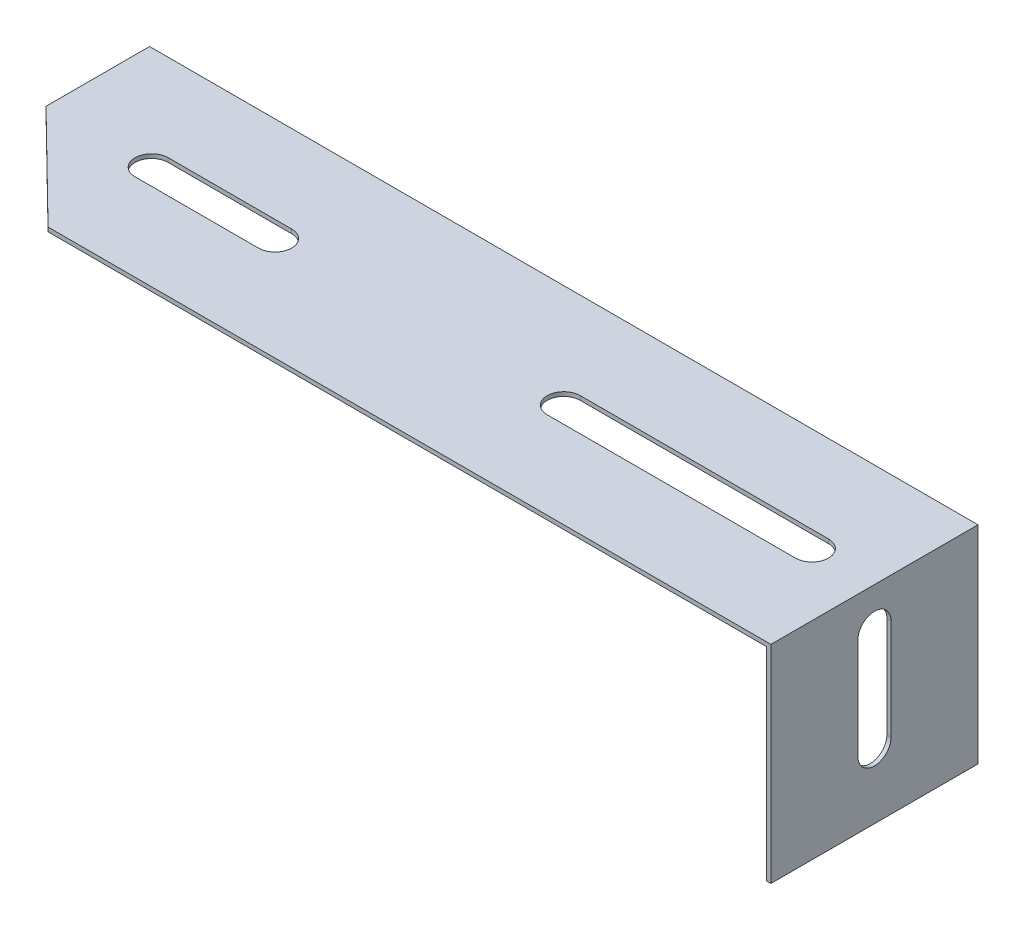
ISO-10303-21;
HEADER;
FILE_DESCRIPTION(('STEP AP214'),'2;1');
FILE_NAME('part.step','',(''),(''),'','','');
FILE_SCHEMA(('AUTOMOTIVE_DESIGN { 1 0 10303 214 1 1 1 1 }'));
ENDSEC;
DATA;
#1=APPLICATION_CONTEXT('core data for automotive mechanical design processes');
#2=APPLICATION_PROTOCOL_DEFINITION('international standard','automotive_design',2000,#1);
#3=PRODUCT_CONTEXT('',#1,'mechanical');
#4=PRODUCT('Part','Part','',(#3));
#5=PRODUCT_RELATED_PRODUCT_CATEGORY('part','',(#4));
#6=PRODUCT_DEFINITION_FORMATION('','',#4);
#7=PRODUCT_DEFINITION_CONTEXT('part definition',#1,'design');
#8=PRODUCT_DEFINITION('design','',#6,#7);
#9=PRODUCT_DEFINITION_SHAPE('','',#8);
#10=(LENGTH_UNIT() NAMED_UNIT(*) SI_UNIT(.MILLI.,.METRE.));
#11=(NAMED_UNIT(*) PLANE_ANGLE_UNIT() SI_UNIT($,.RADIAN.));
#12=(NAMED_UNIT(*) SI_UNIT($,.STERADIAN.) SOLID_ANGLE_UNIT());
#13=UNCERTAINTY_MEASURE_WITH_UNIT(LENGTH_MEASURE(1.E-05),#10,'distance_accuracy_value','');
#14=(GEOMETRIC_REPRESENTATION_CONTEXT(3) GLOBAL_UNCERTAINTY_ASSIGNED_CONTEXT((#13)) GLOBAL_UNIT_ASSIGNED_CONTEXT((#10,
#11,#12)) REPRESENTATION_CONTEXT('',''));
#15=CARTESIAN_POINT('',(0.,0.,0.));
#16=DIRECTION('',(0.,0.,1.));
#17=DIRECTION('',(1.,0.,0.));
#18=AXIS2_PLACEMENT_3D('',#15,#16,#17);
#19=CARTESIAN_POINT('',(0.,0.,0.));
#20=DIRECTION('',(0.,1.,0.));
#21=DIRECTION('',(0.,0.,1.));
#22=AXIS2_PLACEMENT_3D('',#19,#20,#21);
#23=PLANE('',#22);
#24=CARTESIAN_POINT('',(-144.7,0.,-25.));
#25=DIRECTION('',(0.,1.,0.));
#26=DIRECTION('',(0.,0.,1.));
#27=AXIS2_PLACEMENT_3D('',#24,#25,#26);
#28=CIRCLE('',#27,4.);
#29=CARTESIAN_POINT('',(-144.7,0.,-21.));
#30=VERTEX_POINT('',#29);
#31=CARTESIAN_POINT('',(-144.7,0.,-29.));
#32=VERTEX_POINT('',#31);
#33=EDGE_CURVE('E271',#30,#32,#28,.T.);
#34=ORIENTED_EDGE('',*,*,#33,.T.);
#35=DIRECTION('',(1.,0.,0.));
#36=VECTOR('',#35,1.);
#37=CARTESIAN_POINT('',(0.,0.,-29.));
#38=LINE('',#37,#36);
#39=CARTESIAN_POINT('',(-174.5,0.,-29.));
#40=VERTEX_POINT('',#39);
#41=EDGE_CURVE('E280',#40,#32,#38,.T.);
#42=ORIENTED_EDGE('',*,*,#41,.F.);
#43=CARTESIAN_POINT('',(-174.5,0.,-25.));
#44=DIRECTION('',(0.,1.,0.));
#45=DIRECTION('',(0.,0.,1.));
#46=AXIS2_PLACEMENT_3D('',#43,#44,#45);
#47=CIRCLE('',#46,4.);
#48=CARTESIAN_POINT('',(-174.5,0.,-21.));
#49=VERTEX_POINT('',#48);
#50=EDGE_CURVE('E277',#40,#49,#47,.T.);
#51=ORIENTED_EDGE('',*,*,#50,.T.);
#52=DIRECTION('',(1.,0.,0.));
#53=VECTOR('',#52,1.);
#54=CARTESIAN_POINT('',(0.,0.,-21.));
#55=LINE('',#54,#53);
#56=EDGE_CURVE('E274',#49,#30,#55,.T.);
#57=ORIENTED_EDGE('',*,*,#56,.T.);
#58=EDGE_LOOP('',(#34,#42,#51,#57));
#59=FACE_BOUND('',#58,.T.);
#60=CARTESIAN_POINT('',(-15.08,0.,-25.));
#61=DIRECTION('',(0.,1.,0.));
#62=DIRECTION('',(0.,0.,1.));
#63=AXIS2_PLACEMENT_3D('',#60,#61,#62);
#64=CIRCLE('',#63,4.);
#65=CARTESIAN_POINT('',(-15.08,0.,-21.));
#66=VERTEX_POINT('',#65);
#67=CARTESIAN_POINT('',(-15.08,0.,-29.));
#68=VERTEX_POINT('',#67);
#69=EDGE_CURVE('E220',#66,#68,#64,.T.);
#70=ORIENTED_EDGE('',*,*,#69,.T.);
#71=DIRECTION('',(1.,0.,0.));
#72=VECTOR('',#71,1.);
#73=CARTESIAN_POINT('',(0.,0.,-29.));
#74=LINE('',#73,#72);
#75=CARTESIAN_POINT('',(-75.,0.,-29.));
#76=VERTEX_POINT('',#75);
#77=EDGE_CURVE('E268',#76,#68,#74,.T.);
#78=ORIENTED_EDGE('',*,*,#77,.F.);
#79=CARTESIAN_POINT('',(-75.,0.,-25.));
#80=DIRECTION('',(0.,1.,0.));
#81=DIRECTION('',(0.,0.,1.));
#82=AXIS2_PLACEMENT_3D('',#79,#80,#81);
#83=CIRCLE('',#82,4.);
#84=CARTESIAN_POINT('',(-75.,0.,-21.));
#85=VERTEX_POINT('',#84);
#86=EDGE_CURVE('E265',#76,#85,#83,.T.);
#87=ORIENTED_EDGE('',*,*,#86,.T.);
#88=DIRECTION('',(1.,0.,0.));
#89=VECTOR('',#88,1.);
#90=CARTESIAN_POINT('',(0.,0.,-21.));
#91=LINE('',#90,#89);
#92=EDGE_CURVE('E262',#85,#66,#91,.T.);
#93=ORIENTED_EDGE('',*,*,#92,.T.);
#94=EDGE_LOOP('',(#70,#78,#87,#93));
#95=FACE_BOUND('',#94,.T.);
#96=DIRECTION('',(0.,0.,-1.));
#97=VECTOR('',#96,1.);
#98=CARTESIAN_POINT('',(-1.,0.,0.));
#99=LINE('',#98,#97);
#100=CARTESIAN_POINT('',(-1.,0.,0.));
#101=VERTEX_POINT('',#100);
#102=CARTESIAN_POINT('',(-1.,0.,-50.));
#103=VERTEX_POINT('',#102);
#104=EDGE_CURVE('E11',#101,#103,#99,.T.);
#105=ORIENTED_EDGE('',*,*,#104,.F.);
#106=DIRECTION('',(-1.,0.,0.));
#107=VECTOR('',#106,1.);
#108=CARTESIAN_POINT('',(0.,0.,0.));
#109=LINE('',#108,#107);
#110=CARTESIAN_POINT('',(-174.5,0.,0.));
#111=VERTEX_POINT('',#110);
#112=EDGE_CURVE('E289',#101,#111,#109,.T.);
#113=ORIENTED_EDGE('',*,*,#112,.T.);
#114=DIRECTION('',(-0.714072839144579,0.,-0.700071410926057));
#115=VECTOR('',#114,1.);
#116=CARTESIAN_POINT('',(-85.5224465791021,0.,87.2328955106842));
#117=LINE('',#116,#115);
#118=CARTESIAN_POINT('',(-200.,0.,-25.));
#119=VERTEX_POINT('',#118);
#120=EDGE_CURVE('E286',#111,#119,#117,.T.);
#121=ORIENTED_EDGE('',*,*,#120,.T.);
#122=DIRECTION('',(0.,0.,-1.));
#123=VECTOR('',#122,1.);
#124=CARTESIAN_POINT('',(-200.,0.,0.));
#125=LINE('',#124,#123);
#126=CARTESIAN_POINT('',(-200.,0.,-50.));
#127=VERTEX_POINT('',#126);
#128=EDGE_CURVE('E283',#119,#127,#125,.T.);
#129=ORIENTED_EDGE('',*,*,#128,.T.);
#130=DIRECTION('',(-1.,0.,0.));
#131=VECTOR('',#130,1.);
#132=CARTESIAN_POINT('',(0.,0.,-50.));
#133=LINE('',#132,#131);
#134=EDGE_CURVE('E227',#103,#127,#133,.T.);
#135=ORIENTED_EDGE('',*,*,#134,.F.);
#136=EDGE_LOOP('',(#105,#113,#121,#129,#135));
#137=FACE_BOUND('',#136,.T.);
#138=ADVANCED_FACE('F39',(#59,#95,#137),#23,.F.);
#139=CARTESIAN_POINT('',(-200.,1.,0.));
#140=DIRECTION('',(-1.,0.,0.));
#141=DIRECTION('',(0.,0.,1.));
#142=AXIS2_PLACEMENT_3D('',#139,#140,#141);
#143=PLANE('',#142);
#144=ORIENTED_EDGE('',*,*,#128,.F.);
#145=DIRECTION('',(0.,-1.,0.));
#146=VECTOR('',#145,1.);
#147=CARTESIAN_POINT('',(-200.,1.,-25.));
#148=LINE('',#147,#146);
#149=CARTESIAN_POINT('',(-200.,1.,-25.));
#150=VERTEX_POINT('',#149);
#151=EDGE_CURVE('E47',#150,#119,#148,.T.);
#152=ORIENTED_EDGE('',*,*,#151,.F.);
#153=DIRECTION('',(0.,0.,-1.));
#154=VECTOR('',#153,1.);
#155=CARTESIAN_POINT('',(-200.,1.,0.));
#156=LINE('',#155,#154);
#157=CARTESIAN_POINT('',(-200.,1.,-50.));
#158=VERTEX_POINT('',#157);
#159=EDGE_CURVE('E246',#150,#158,#156,.T.);
#160=ORIENTED_EDGE('',*,*,#159,.T.);
#161=DIRECTION('',(0.,-1.,0.));
#162=VECTOR('',#161,1.);
#163=CARTESIAN_POINT('',(-200.,1.,-50.));
#164=LINE('',#163,#162);
#165=EDGE_CURVE('E292',#158,#127,#164,.T.);
#166=ORIENTED_EDGE('',*,*,#165,.T.);
#167=EDGE_LOOP('',(#144,#152,#160,#166));
#168=FACE_BOUND('',#167,.T.);
#169=ADVANCED_FACE('F352',(#168),#143,.T.);
#170=CARTESIAN_POINT('',(-85.5224465791021,1.,87.2328955106842));
#171=DIRECTION('',(-0.700071410926057,0.,0.714072839144579));
#172=DIRECTION('',(0.714072839144579,0.,0.700071410926057));
#173=AXIS2_PLACEMENT_3D('',#170,#171,#172);
#174=PLANE('',#173);
#175=ORIENTED_EDGE('',*,*,#120,.F.);
#176=DIRECTION('',(0.,-1.,0.));
#177=VECTOR('',#176,1.);
#178=CARTESIAN_POINT('',(-174.5,1.,0.));
#179=LINE('',#178,#177);
#180=CARTESIAN_POINT('',(-174.5,1.,0.));
#181=VERTEX_POINT('',#180);
#182=EDGE_CURVE('E300',#181,#111,#179,.T.);
#183=ORIENTED_EDGE('',*,*,#182,.F.);
#184=DIRECTION('',(-0.714072839144579,0.,-0.700071410926057));
#185=VECTOR('',#184,1.);
#186=CARTESIAN_POINT('',(-85.5224465791021,1.,87.2328955106842));
#187=LINE('',#186,#185);
#188=EDGE_CURVE('E249',#181,#150,#187,.T.);
#189=ORIENTED_EDGE('',*,*,#188,.T.);
#190=ORIENTED_EDGE('',*,*,#151,.T.);
#191=EDGE_LOOP('',(#175,#183,#189,#190));
#192=FACE_BOUND('',#191,.T.);
#193=ADVANCED_FACE('F358',(#192),#174,.T.);
#194=CARTESIAN_POINT('',(0.,1.,0.));
#195=DIRECTION('',(0.,0.,1.));
#196=DIRECTION('',(1.,0.,0.));
#197=AXIS2_PLACEMENT_3D('',#194,#195,#196);
#198=PLANE('',#197);
#199=DIRECTION('',(-1.,0.,0.));
#200=VECTOR('',#199,1.);
#201=CARTESIAN_POINT('',(0.,1.,0.));
#202=LINE('',#201,#200);
#203=CARTESIAN_POINT('',(0.,1.,0.));
#204=VERTEX_POINT('',#203);
#205=EDGE_CURVE('E252',#204,#181,#202,.T.);
#206=ORIENTED_EDGE('',*,*,#205,.T.);
#207=ORIENTED_EDGE('',*,*,#182,.T.);
#208=ORIENTED_EDGE('',*,*,#112,.F.);
#209=DIRECTION('',(0.,-1.,0.));
#210=VECTOR('',#209,1.);
#211=CARTESIAN_POINT('',(-1.,1.,0.));
#212=LINE('',#211,#210);
#213=CARTESIAN_POINT('',(-1.,-49.,0.));
#214=VERTEX_POINT('',#213);
#215=EDGE_CURVE('E206',#101,#214,#212,.T.);
#216=ORIENTED_EDGE('',*,*,#215,.T.);
#217=DIRECTION('',(1.,0.,0.));
#218=VECTOR('',#217,1.);
#219=CARTESIAN_POINT('',(-1.,-49.,0.));
#220=LINE('',#219,#218);
#221=CARTESIAN_POINT('',(0.,-49.,0.));
#222=VERTEX_POINT('',#221);
#223=EDGE_CURVE('E214',#214,#222,#220,.T.);
#224=ORIENTED_EDGE('',*,*,#223,.T.);
#225=DIRECTION('',(0.,-1.,0.));
#226=VECTOR('',#225,1.);
#227=CARTESIAN_POINT('',(0.,1.,0.));
#228=LINE('',#227,#226);
#229=EDGE_CURVE('E298',#204,#222,#228,.T.);
#230=ORIENTED_EDGE('',*,*,#229,.F.);
#231=EDGE_LOOP('',(#206,#207,#208,#216,#224,#230));
#232=FACE_BOUND('',#231,.T.);
#233=ADVANCED_FACE('F368',(#232),#198,.T.);
#234=CARTESIAN_POINT('',(0.,1.,0.));
#235=DIRECTION('',(-1.,0.,0.));
#236=DIRECTION('',(0.,0.,1.));
#237=AXIS2_PLACEMENT_3D('',#234,#235,#236);
#238=PLANE('',#237);
#239=DIRECTION('',(0.,-1.,0.));
#240=VECTOR('',#239,1.);
#241=CARTESIAN_POINT('',(0.,-8.58942274015277,-21.));
#242=LINE('',#241,#240);
#243=CARTESIAN_POINT('',(0.,-8.58942274015277,-21.));
#244=VERTEX_POINT('',#243);
#245=CARTESIAN_POINT('',(0.,-32.9152099850345,-21.));
#246=VERTEX_POINT('',#245);
#247=EDGE_CURVE('E196',#244,#246,#242,.T.);
#248=ORIENTED_EDGE('',*,*,#247,.F.);
#249=CARTESIAN_POINT('',(0.,-8.58942274015277,-25.));
#250=DIRECTION('',(1.,0.,0.));
#251=DIRECTION('',(0.,0.,-1.));
#252=AXIS2_PLACEMENT_3D('',#249,#250,#251);
#253=CIRCLE('',#252,4.);
#254=CARTESIAN_POINT('',(0.,-8.58942274015277,-29.));
#255=VERTEX_POINT('',#254);
#256=EDGE_CURVE('E54',#255,#244,#253,.T.);
#257=ORIENTED_EDGE('',*,*,#256,.F.);
#258=DIRECTION('',(0.,1.,0.));
#259=VECTOR('',#258,1.);
#260=CARTESIAN_POINT('',(0.,-8.58942274015277,-29.));
#261=LINE('',#260,#259);
#262=CARTESIAN_POINT('',(0.,-32.9152099850345,-29.));
#263=VERTEX_POINT('',#262);
#264=EDGE_CURVE('E187',#263,#255,#261,.T.);
#265=ORIENTED_EDGE('',*,*,#264,.F.);
#266=CARTESIAN_POINT('',(0.,-32.9152099850345,-25.));
#267=DIRECTION('',(1.,0.,0.));
#268=DIRECTION('',(0.,0.,-1.));
#269=AXIS2_PLACEMENT_3D('',#266,#267,#268);
#270=CIRCLE('',#269,4.);
#271=EDGE_CURVE('E190',#246,#263,#270,.T.);
#272=ORIENTED_EDGE('',*,*,#271,.F.);
#273=EDGE_LOOP('',(#248,#257,#265,#272));
#274=FACE_BOUND('',#273,.T.);
#275=ORIENTED_EDGE('',*,*,#229,.T.);
#276=DIRECTION('',(0.,0.,-1.));
#277=VECTOR('',#276,1.);
#278=CARTESIAN_POINT('',(0.,-49.,0.));
#279=LINE('',#278,#277);
#280=CARTESIAN_POINT('',(0.,-49.,-50.));
#281=VERTEX_POINT('',#280);
#282=EDGE_CURVE('E202',#222,#281,#279,.T.);
#283=ORIENTED_EDGE('',*,*,#282,.T.);
#284=DIRECTION('',(0.,-1.,0.));
#285=VECTOR('',#284,1.);
#286=CARTESIAN_POINT('',(0.,1.,-50.));
#287=LINE('',#286,#285);
#288=CARTESIAN_POINT('',(0.,1.,-50.));
#289=VERTEX_POINT('',#288);
#290=EDGE_CURVE('E295',#289,#281,#287,.T.);
#291=ORIENTED_EDGE('',*,*,#290,.F.);
#292=DIRECTION('',(0.,0.,-1.));
#293=VECTOR('',#292,1.);
#294=CARTESIAN_POINT('',(0.,1.,0.));
#295=LINE('',#294,#293);
#296=EDGE_CURVE('E254',#204,#289,#295,.T.);
#297=ORIENTED_EDGE('',*,*,#296,.F.);
#298=EDGE_LOOP('',(#275,#283,#291,#297));
#299=FACE_BOUND('',#298,.T.);
#300=ADVANCED_FACE('F364',(#274,#299),#238,.F.);
#301=CARTESIAN_POINT('',(-144.7,1.,-25.));
#302=DIRECTION('',(0.,-1.,0.));
#303=DIRECTION('',(0.,0.,-1.));
#304=AXIS2_PLACEMENT_3D('',#301,#302,#303);
#305=CYLINDRICAL_SURFACE('',#304,4.);
#306=ORIENTED_EDGE('',*,*,#33,.F.);
#307=DIRECTION('',(0.,-1.,0.));
#308=VECTOR('',#307,1.);
#309=CARTESIAN_POINT('',(-144.7,1.,-21.));
#310=LINE('',#309,#308);
#311=CARTESIAN_POINT('',(-144.7,1.,-21.));
#312=VERTEX_POINT('',#311);
#313=EDGE_CURVE('E296',#312,#30,#310,.T.);
#314=ORIENTED_EDGE('',*,*,#313,.F.);
#315=CARTESIAN_POINT('',(-144.7,1.,-25.));
#316=DIRECTION('',(0.,1.,0.));
#317=DIRECTION('',(0.,0.,1.));
#318=AXIS2_PLACEMENT_3D('',#315,#316,#317);
#319=CIRCLE('',#318,4.);
#320=CARTESIAN_POINT('',(-144.7,1.,-29.));
#321=VERTEX_POINT('',#320);
#322=EDGE_CURVE('E235',#312,#321,#319,.T.);
#323=ORIENTED_EDGE('',*,*,#322,.T.);
#324=DIRECTION('',(0.,-1.,0.));
#325=VECTOR('',#324,1.);
#326=CARTESIAN_POINT('',(-144.7,1.,-29.));
#327=LINE('',#326,#325);
#328=EDGE_CURVE('E304',#321,#32,#327,.T.);
#329=ORIENTED_EDGE('',*,*,#328,.T.);
#330=EDGE_LOOP('',(#306,#314,#323,#329));
#331=FACE_BOUND('',#330,.T.);
#332=ADVANCED_FACE('F367',(#331),#305,.F.);
#333=CARTESIAN_POINT('',(0.,1.,-21.));
#334=DIRECTION('',(0.,0.,-1.));
#335=DIRECTION('',(-1.,0.,0.));
#336=AXIS2_PLACEMENT_3D('',#333,#334,#335);
#337=PLANE('',#336);
#338=ORIENTED_EDGE('',*,*,#56,.F.);
#339=DIRECTION('',(0.,-1.,0.));
#340=VECTOR('',#339,1.);
#341=CARTESIAN_POINT('',(-174.5,1.,-21.));
#342=LINE('',#341,#340);
#343=CARTESIAN_POINT('',(-174.5,1.,-21.));
#344=VERTEX_POINT('',#343);
#345=EDGE_CURVE('E309',#344,#49,#342,.T.);
#346=ORIENTED_EDGE('',*,*,#345,.F.);
#347=DIRECTION('',(1.,0.,0.));
#348=VECTOR('',#347,1.);
#349=CARTESIAN_POINT('',(0.,1.,-21.));
#350=LINE('',#349,#348);
#351=EDGE_CURVE('E238',#344,#312,#350,.T.);
#352=ORIENTED_EDGE('',*,*,#351,.T.);
#353=ORIENTED_EDGE('',*,*,#313,.T.);
#354=EDGE_LOOP('',(#338,#346,#352,#353));
#355=FACE_BOUND('',#354,.T.);
#356=ADVANCED_FACE('F379',(#355),#337,.T.);
#357=CARTESIAN_POINT('',(-174.5,1.,-25.));
#358=DIRECTION('',(0.,-1.,0.));
#359=DIRECTION('',(0.,0.,-1.));
#360=AXIS2_PLACEMENT_3D('',#357,#358,#359);
#361=CYLINDRICAL_SURFACE('',#360,4.);
#362=ORIENTED_EDGE('',*,*,#50,.F.);
#363=DIRECTION('',(0.,-1.,0.));
#364=VECTOR('',#363,1.);
#365=CARTESIAN_POINT('',(-174.5,1.,-29.));
#366=LINE('',#365,#364);
#367=CARTESIAN_POINT('',(-174.5,1.,-29.));
#368=VERTEX_POINT('',#367);
#369=EDGE_CURVE('E306',#368,#40,#366,.T.);
#370=ORIENTED_EDGE('',*,*,#369,.F.);
#371=CARTESIAN_POINT('',(-174.5,1.,-25.));
#372=DIRECTION('',(0.,1.,0.));
#373=DIRECTION('',(0.,0.,1.));
#374=AXIS2_PLACEMENT_3D('',#371,#372,#373);
#375=CIRCLE('',#374,4.);
#376=EDGE_CURVE('E241',#368,#344,#375,.T.);
#377=ORIENTED_EDGE('',*,*,#376,.T.);
#378=ORIENTED_EDGE('',*,*,#345,.T.);
#379=EDGE_LOOP('',(#362,#370,#377,#378));
#380=FACE_BOUND('',#379,.T.);
#381=ADVANCED_FACE('F376',(#380),#361,.F.);
#382=CARTESIAN_POINT('',(-15.08,1.,-25.));
#383=DIRECTION('',(0.,-1.,0.));
#384=DIRECTION('',(0.,0.,-1.));
#385=AXIS2_PLACEMENT_3D('',#382,#383,#384);
#386=CYLINDRICAL_SURFACE('',#385,4.);
#387=ORIENTED_EDGE('',*,*,#69,.F.);
#388=DIRECTION('',(0.,-1.,0.));
#389=VECTOR('',#388,1.);
#390=CARTESIAN_POINT('',(-15.08,1.,-21.));
#391=LINE('',#390,#389);
#392=CARTESIAN_POINT('',(-15.08,1.,-21.));
#393=VERTEX_POINT('',#392);
#394=EDGE_CURVE('E307',#393,#66,#391,.T.);
#395=ORIENTED_EDGE('',*,*,#394,.F.);
#396=CARTESIAN_POINT('',(-15.08,1.,-25.));
#397=DIRECTION('',(0.,1.,0.));
#398=DIRECTION('',(0.,0.,1.));
#399=AXIS2_PLACEMENT_3D('',#396,#397,#398);
#400=CIRCLE('',#399,4.);
#401=CARTESIAN_POINT('',(-15.08,1.,-29.));
#402=VERTEX_POINT('',#401);
#403=EDGE_CURVE('E223',#393,#402,#400,.T.);
#404=ORIENTED_EDGE('',*,*,#403,.T.);
#405=DIRECTION('',(0.,-1.,0.));
#406=VECTOR('',#405,1.);
#407=CARTESIAN_POINT('',(-15.08,1.,-29.));
#408=LINE('',#407,#406);
#409=EDGE_CURVE('E259',#402,#68,#408,.T.);
#410=ORIENTED_EDGE('',*,*,#409,.T.);
#411=EDGE_LOOP('',(#387,#395,#404,#410));
#412=FACE_BOUND('',#411,.T.);
#413=ADVANCED_FACE('F41',(#412),#386,.F.);
#414=CARTESIAN_POINT('',(0.,1.,-21.));
#415=DIRECTION('',(0.,0.,-1.));
#416=DIRECTION('',(-1.,0.,0.));
#417=AXIS2_PLACEMENT_3D('',#414,#415,#416);
#418=PLANE('',#417);
#419=ORIENTED_EDGE('',*,*,#92,.F.);
#420=DIRECTION('',(0.,-1.,0.));
#421=VECTOR('',#420,1.);
#422=CARTESIAN_POINT('',(-75.,1.,-21.));
#423=LINE('',#422,#421);
#424=CARTESIAN_POINT('',(-75.,1.,-21.));
#425=VERTEX_POINT('',#424);
#426=EDGE_CURVE('E315',#425,#85,#423,.T.);
#427=ORIENTED_EDGE('',*,*,#426,.F.);
#428=DIRECTION('',(1.,0.,0.));
#429=VECTOR('',#428,1.);
#430=CARTESIAN_POINT('',(0.,1.,-21.));
#431=LINE('',#430,#429);
#432=EDGE_CURVE('E226',#425,#393,#431,.T.);
#433=ORIENTED_EDGE('',*,*,#432,.T.);
#434=ORIENTED_EDGE('',*,*,#394,.T.);
#435=EDGE_LOOP('',(#419,#427,#433,#434));
#436=FACE_BOUND('',#435,.T.);
#437=ADVANCED_FACE('F319',(#436),#418,.T.);
#438=CARTESIAN_POINT('',(-75.,1.,-25.));
#439=DIRECTION('',(0.,-1.,0.));
#440=DIRECTION('',(0.,0.,-1.));
#441=AXIS2_PLACEMENT_3D('',#438,#439,#440);
#442=CYLINDRICAL_SURFACE('',#441,4.);
#443=ORIENTED_EDGE('',*,*,#86,.F.);
#444=DIRECTION('',(0.,-1.,0.));
#445=VECTOR('',#444,1.);
#446=CARTESIAN_POINT('',(-75.,1.,-29.));
#447=LINE('',#446,#445);
#448=CARTESIAN_POINT('',(-75.,1.,-29.));
#449=VERTEX_POINT('',#448);
#450=EDGE_CURVE('E313',#449,#76,#447,.T.);
#451=ORIENTED_EDGE('',*,*,#450,.F.);
#452=CARTESIAN_POINT('',(-75.,1.,-25.));
#453=DIRECTION('',(0.,1.,0.));
#454=DIRECTION('',(0.,0.,1.));
#455=AXIS2_PLACEMENT_3D('',#452,#453,#454);
#456=CIRCLE('',#455,4.);
#457=EDGE_CURVE('E230',#449,#425,#456,.T.);
#458=ORIENTED_EDGE('',*,*,#457,.T.);
#459=ORIENTED_EDGE('',*,*,#426,.T.);
#460=EDGE_LOOP('',(#443,#451,#458,#459));
#461=FACE_BOUND('',#460,.T.);
#462=ADVANCED_FACE('F329',(#461),#442,.F.);
#463=CARTESIAN_POINT('',(0.,1.,-29.));
#464=DIRECTION('',(0.,0.,-1.));
#465=DIRECTION('',(-1.,0.,0.));
#466=AXIS2_PLACEMENT_3D('',#463,#464,#465);
#467=PLANE('',#466);
#468=ORIENTED_EDGE('',*,*,#41,.T.);
#469=ORIENTED_EDGE('',*,*,#328,.F.);
#470=DIRECTION('',(1.,0.,0.));
#471=VECTOR('',#470,1.);
#472=CARTESIAN_POINT('',(0.,1.,-29.));
#473=LINE('',#472,#471);
#474=EDGE_CURVE('E244',#368,#321,#473,.T.);
#475=ORIENTED_EDGE('',*,*,#474,.F.);
#476=ORIENTED_EDGE('',*,*,#369,.T.);
#477=EDGE_LOOP('',(#468,#469,#475,#476));
#478=FACE_BOUND('',#477,.T.);
#479=ADVANCED_FACE('F339',(#478),#467,.F.);
#480=CARTESIAN_POINT('',(0.,1.,-29.));
#481=DIRECTION('',(0.,0.,-1.));
#482=DIRECTION('',(-1.,0.,0.));
#483=AXIS2_PLACEMENT_3D('',#480,#481,#482);
#484=PLANE('',#483);
#485=ORIENTED_EDGE('',*,*,#77,.T.);
#486=ORIENTED_EDGE('',*,*,#409,.F.);
#487=DIRECTION('',(1.,0.,0.));
#488=VECTOR('',#487,1.);
#489=CARTESIAN_POINT('',(0.,1.,-29.));
#490=LINE('',#489,#488);
#491=EDGE_CURVE('E233',#449,#402,#490,.T.);
#492=ORIENTED_EDGE('',*,*,#491,.F.);
#493=ORIENTED_EDGE('',*,*,#450,.T.);
#494=EDGE_LOOP('',(#485,#486,#492,#493));
#495=FACE_BOUND('',#494,.T.);
#496=ADVANCED_FACE('F336',(#495),#484,.F.);
#497=CARTESIAN_POINT('',(0.,1.,-50.));
#498=DIRECTION('',(0.,0.,1.));
#499=DIRECTION('',(1.,0.,0.));
#500=AXIS2_PLACEMENT_3D('',#497,#498,#499);
#501=PLANE('',#500);
#502=ORIENTED_EDGE('',*,*,#290,.T.);
#503=DIRECTION('',(1.,0.,0.));
#504=VECTOR('',#503,1.);
#505=CARTESIAN_POINT('',(-1.,-49.,-50.));
#506=LINE('',#505,#504);
#507=CARTESIAN_POINT('',(-1.,-49.,-50.));
#508=VERTEX_POINT('',#507);
#509=EDGE_CURVE('E217',#508,#281,#506,.T.);
#510=ORIENTED_EDGE('',*,*,#509,.F.);
#511=DIRECTION('',(0.,1.,0.));
#512=VECTOR('',#511,1.);
#513=CARTESIAN_POINT('',(-1.,1.,-50.));
#514=LINE('',#513,#512);
#515=EDGE_CURVE('E211',#508,#103,#514,.T.);
#516=ORIENTED_EDGE('',*,*,#515,.T.);
#517=ORIENTED_EDGE('',*,*,#134,.T.);
#518=ORIENTED_EDGE('',*,*,#165,.F.);
#519=DIRECTION('',(-1.,0.,0.));
#520=VECTOR('',#519,1.);
#521=CARTESIAN_POINT('',(0.,1.,-50.));
#522=LINE('',#521,#520);
#523=EDGE_CURVE('E257',#289,#158,#522,.T.);
#524=ORIENTED_EDGE('',*,*,#523,.F.);
#525=EDGE_LOOP('',(#502,#510,#516,#517,#518,#524));
#526=FACE_BOUND('',#525,.T.);
#527=ADVANCED_FACE('F338',(#526),#501,.F.);
#528=CARTESIAN_POINT('',(0.,1.,0.));
#529=DIRECTION('',(0.,1.,0.));
#530=DIRECTION('',(0.,0.,1.));
#531=AXIS2_PLACEMENT_3D('',#528,#529,#530);
#532=PLANE('',#531);
#533=ORIENTED_EDGE('',*,*,#523,.T.);
#534=ORIENTED_EDGE('',*,*,#159,.F.);
#535=ORIENTED_EDGE('',*,*,#188,.F.);
#536=ORIENTED_EDGE('',*,*,#205,.F.);
#537=ORIENTED_EDGE('',*,*,#296,.T.);
#538=EDGE_LOOP('',(#533,#534,#535,#536,#537));
#539=FACE_BOUND('',#538,.T.);
#540=ORIENTED_EDGE('',*,*,#403,.F.);
#541=ORIENTED_EDGE('',*,*,#432,.F.);
#542=ORIENTED_EDGE('',*,*,#457,.F.);
#543=ORIENTED_EDGE('',*,*,#491,.T.);
#544=EDGE_LOOP('',(#540,#541,#542,#543));
#545=FACE_BOUND('',#544,.T.);
#546=ORIENTED_EDGE('',*,*,#322,.F.);
#547=ORIENTED_EDGE('',*,*,#351,.F.);
#548=ORIENTED_EDGE('',*,*,#376,.F.);
#549=ORIENTED_EDGE('',*,*,#474,.T.);
#550=EDGE_LOOP('',(#546,#547,#548,#549));
#551=FACE_BOUND('',#550,.T.);
#552=ADVANCED_FACE('F333',(#539,#545,#551),#532,.T.);
#553=CARTESIAN_POINT('',(-1.,0.,0.));
#554=DIRECTION('',(1.,0.,0.));
#555=DIRECTION('',(0.,0.,-1.));
#556=AXIS2_PLACEMENT_3D('',#553,#554,#555);
#557=PLANE('',#556);
#558=DIRECTION('',(0.,1.,0.));
#559=VECTOR('',#558,1.);
#560=CARTESIAN_POINT('',(-1.,-8.58942274015277,-29.));
#561=LINE('',#560,#559);
#562=CARTESIAN_POINT('',(-1.,-32.9152099850345,-29.));
#563=VERTEX_POINT('',#562);
#564=CARTESIAN_POINT('',(-1.,-8.58942274015277,-29.));
#565=VERTEX_POINT('',#564);
#566=EDGE_CURVE('E177',#563,#565,#561,.T.);
#567=ORIENTED_EDGE('',*,*,#566,.T.);
#568=CARTESIAN_POINT('',(-1.,-8.58942274015277,-25.));
#569=DIRECTION('',(1.,0.,0.));
#570=DIRECTION('',(0.,0.,-1.));
#571=AXIS2_PLACEMENT_3D('',#568,#569,#570);
#572=CIRCLE('',#571,4.);
#573=CARTESIAN_POINT('',(-1.,-8.58942274015277,-21.));
#574=VERTEX_POINT('',#573);
#575=EDGE_CURVE('E171',#565,#574,#572,.T.);
#576=ORIENTED_EDGE('',*,*,#575,.T.);
#577=DIRECTION('',(0.,-1.,0.));
#578=VECTOR('',#577,1.);
#579=CARTESIAN_POINT('',(-1.,-8.58942274015277,-21.));
#580=LINE('',#579,#578);
#581=CARTESIAN_POINT('',(-1.,-32.9152099850345,-21.));
#582=VERTEX_POINT('',#581);
#583=EDGE_CURVE('E180',#574,#582,#580,.T.);
#584=ORIENTED_EDGE('',*,*,#583,.T.);
#585=CARTESIAN_POINT('',(-1.,-32.9152099850345,-25.));
#586=DIRECTION('',(1.,0.,0.));
#587=DIRECTION('',(0.,0.,-1.));
#588=AXIS2_PLACEMENT_3D('',#585,#586,#587);
#589=CIRCLE('',#588,4.);
#590=EDGE_CURVE('E62',#582,#563,#589,.T.);
#591=ORIENTED_EDGE('',*,*,#590,.T.);
#592=EDGE_LOOP('',(#567,#576,#584,#591));
#593=FACE_BOUND('',#592,.T.);
#594=ORIENTED_EDGE('',*,*,#215,.F.);
#595=ORIENTED_EDGE('',*,*,#104,.T.);
#596=ORIENTED_EDGE('',*,*,#515,.F.);
#597=DIRECTION('',(0.,0.,-1.));
#598=VECTOR('',#597,1.);
#599=CARTESIAN_POINT('',(-1.,-49.,0.));
#600=LINE('',#599,#598);
#601=EDGE_CURVE('E208',#214,#508,#600,.T.);
#602=ORIENTED_EDGE('',*,*,#601,.F.);
#603=EDGE_LOOP('',(#594,#595,#596,#602));
#604=FACE_BOUND('',#603,.T.);
#605=ADVANCED_FACE('F184',(#593,#604),#557,.F.);
#606=CARTESIAN_POINT('',(-1.,-49.,0.));
#607=DIRECTION('',(0.,-1.,0.));
#608=DIRECTION('',(0.,0.,-1.));
#609=AXIS2_PLACEMENT_3D('',#606,#607,#608);
#610=PLANE('',#609);
#611=ORIENTED_EDGE('',*,*,#282,.F.);
#612=ORIENTED_EDGE('',*,*,#223,.F.);
#613=ORIENTED_EDGE('',*,*,#601,.T.);
#614=ORIENTED_EDGE('',*,*,#509,.T.);
#615=EDGE_LOOP('',(#611,#612,#613,#614));
#616=FACE_BOUND('',#615,.T.);
#617=ADVANCED_FACE('F401',(#616),#610,.T.);
#618=CARTESIAN_POINT('',(-1.,-8.58942274015277,-25.));
#619=DIRECTION('',(1.,0.,0.));
#620=DIRECTION('',(0.,0.,-1.));
#621=AXIS2_PLACEMENT_3D('',#618,#619,#620);
#622=CYLINDRICAL_SURFACE('',#621,4.);
#623=ORIENTED_EDGE('',*,*,#256,.T.);
#624=DIRECTION('',(1.,0.,0.));
#625=VECTOR('',#624,1.);
#626=CARTESIAN_POINT('',(-1.,-8.58942274015277,-21.));
#627=LINE('',#626,#625);
#628=EDGE_CURVE('E167',#574,#244,#627,.T.);
#629=ORIENTED_EDGE('',*,*,#628,.F.);
#630=ORIENTED_EDGE('',*,*,#575,.F.);
#631=DIRECTION('',(1.,0.,0.));
#632=VECTOR('',#631,1.);
#633=CARTESIAN_POINT('',(-1.,-8.58942274015277,-29.));
#634=LINE('',#633,#632);
#635=EDGE_CURVE('E200',#565,#255,#634,.T.);
#636=ORIENTED_EDGE('',*,*,#635,.T.);
#637=EDGE_LOOP('',(#623,#629,#630,#636));
#638=FACE_BOUND('',#637,.T.);
#639=ADVANCED_FACE('F169',(#638),#622,.F.);
#640=CARTESIAN_POINT('',(-1.,-8.58942274015277,-29.));
#641=DIRECTION('',(0.,0.,-1.));
#642=DIRECTION('',(-1.,0.,0.));
#643=AXIS2_PLACEMENT_3D('',#640,#641,#642);
#644=PLANE('',#643);
#645=ORIENTED_EDGE('',*,*,#264,.T.);
#646=ORIENTED_EDGE('',*,*,#635,.F.);
#647=ORIENTED_EDGE('',*,*,#566,.F.);
#648=DIRECTION('',(1.,0.,0.));
#649=VECTOR('',#648,1.);
#650=CARTESIAN_POINT('',(-1.,-32.9152099850345,-29.));
#651=LINE('',#650,#649);
#652=EDGE_CURVE('E203',#563,#263,#651,.T.);
#653=ORIENTED_EDGE('',*,*,#652,.T.);
#654=EDGE_LOOP('',(#645,#646,#647,#653));
#655=FACE_BOUND('',#654,.T.);
#656=ADVANCED_FACE('F425',(#655),#644,.F.);
#657=CARTESIAN_POINT('',(-1.,-32.9152099850345,-25.));
#658=DIRECTION('',(1.,0.,0.));
#659=DIRECTION('',(0.,0.,-1.));
#660=AXIS2_PLACEMENT_3D('',#657,#658,#659);
#661=CYLINDRICAL_SURFACE('',#660,4.);
#662=ORIENTED_EDGE('',*,*,#271,.T.);
#663=ORIENTED_EDGE('',*,*,#652,.F.);
#664=ORIENTED_EDGE('',*,*,#590,.F.);
#665=DIRECTION('',(1.,0.,0.));
#666=VECTOR('',#665,1.);
#667=CARTESIAN_POINT('',(-1.,-32.9152099850345,-21.));
#668=LINE('',#667,#666);
#669=EDGE_CURVE('E176',#582,#246,#668,.T.);
#670=ORIENTED_EDGE('',*,*,#669,.T.);
#671=EDGE_LOOP('',(#662,#663,#664,#670));
#672=FACE_BOUND('',#671,.T.);
#673=ADVANCED_FACE('F430',(#672),#661,.F.);
#674=CARTESIAN_POINT('',(-1.,-8.58942274015277,-21.));
#675=DIRECTION('',(0.,0.,1.));
#676=DIRECTION('',(0.,-1.,0.));
#677=AXIS2_PLACEMENT_3D('',#674,#675,#676);
#678=PLANE('',#677);
#679=ORIENTED_EDGE('',*,*,#247,.T.);
#680=ORIENTED_EDGE('',*,*,#669,.F.);
#681=ORIENTED_EDGE('',*,*,#583,.F.);
#682=ORIENTED_EDGE('',*,*,#628,.T.);
#683=EDGE_LOOP('',(#679,#680,#681,#682));
#684=FACE_BOUND('',#683,.T.);
#685=ADVANCED_FACE('F181',(#684),#678,.F.);
#686=CLOSED_SHELL('',(#138,#169,#193,#233,#300,#332,#356,#381,#413,#437,#462,#479,#496,#527,
#552,#605,#617,#639,#656,#673,#685));
#687=MANIFOLD_SOLID_BREP('B2',#686);
#688=ADVANCED_BREP_SHAPE_REPRESENTATION('',(#18,#687),#14);
#689=SHAPE_DEFINITION_REPRESENTATION(#9,#688);
ENDSEC;
END-ISO-10303-21;
